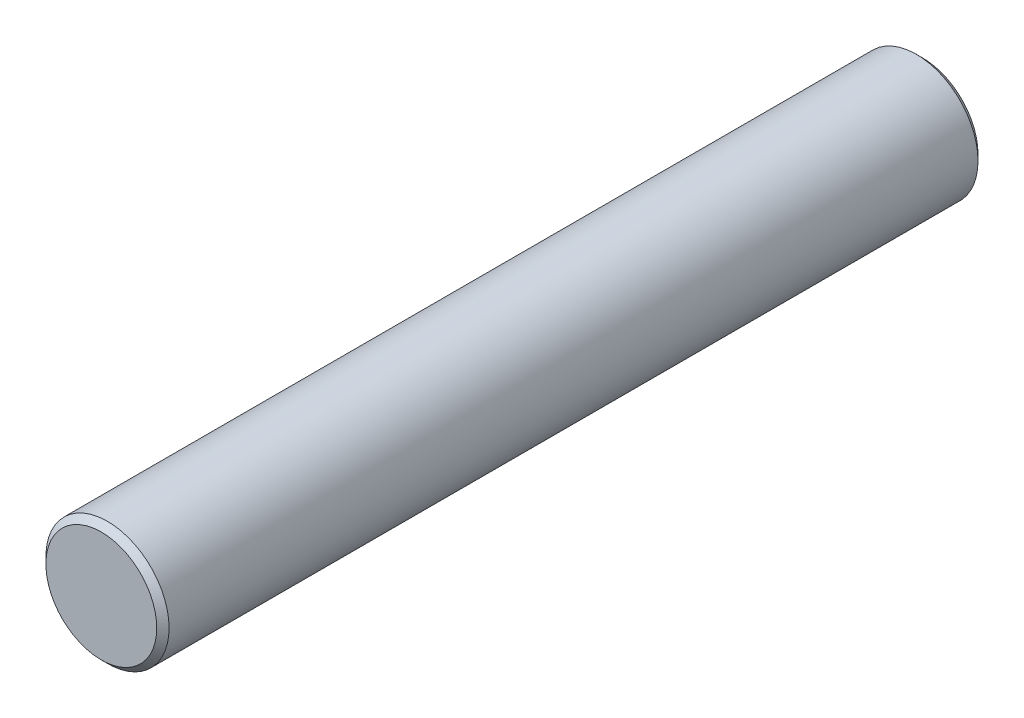
ISO-10303-21;
HEADER;
FILE_DESCRIPTION(('STEP AP214'),'2;1');
FILE_NAME('part.step','',(''),(''),'','','');
FILE_SCHEMA(('AUTOMOTIVE_DESIGN { 1 0 10303 214 1 1 1 1 }'));
ENDSEC;
DATA;
#1=APPLICATION_CONTEXT('core data for automotive mechanical design processes');
#2=APPLICATION_PROTOCOL_DEFINITION('international standard','automotive_design',2000,#1);
#3=PRODUCT_CONTEXT('',#1,'mechanical');
#4=PRODUCT('Part','Part','',(#3));
#5=PRODUCT_RELATED_PRODUCT_CATEGORY('part','',(#4));
#6=PRODUCT_DEFINITION_FORMATION('','',#4);
#7=PRODUCT_DEFINITION_CONTEXT('part definition',#1,'design');
#8=PRODUCT_DEFINITION('design','',#6,#7);
#9=PRODUCT_DEFINITION_SHAPE('','',#8);
#10=(LENGTH_UNIT() NAMED_UNIT(*) SI_UNIT(.MILLI.,.METRE.));
#11=(NAMED_UNIT(*) PLANE_ANGLE_UNIT() SI_UNIT($,.RADIAN.));
#12=(NAMED_UNIT(*) SI_UNIT($,.STERADIAN.) SOLID_ANGLE_UNIT());
#13=UNCERTAINTY_MEASURE_WITH_UNIT(LENGTH_MEASURE(1.E-05),#10,'distance_accuracy_value','');
#14=(GEOMETRIC_REPRESENTATION_CONTEXT(3) GLOBAL_UNCERTAINTY_ASSIGNED_CONTEXT((#13)) GLOBAL_UNIT_ASSIGNED_CONTEXT((#10,
#11,#12)) REPRESENTATION_CONTEXT('',''));
#15=CARTESIAN_POINT('',(0.,0.,0.));
#16=DIRECTION('',(0.,0.,1.));
#17=DIRECTION('',(1.,0.,0.));
#18=AXIS2_PLACEMENT_3D('',#15,#16,#17);
#19=CARTESIAN_POINT('',(0.,0.,10.));
#20=DIRECTION('',(0.,0.,-1.));
#21=DIRECTION('',(-1.,0.,0.));
#22=AXIS2_PLACEMENT_3D('',#19,#20,#21);
#23=CYLINDRICAL_SURFACE('',#22,1.5);
#24=CARTESIAN_POINT('',(0.,0.,-9.85));
#25=DIRECTION('',(0.,0.,1.));
#26=DIRECTION('',(1.,0.,0.));
#27=AXIS2_PLACEMENT_3D('',#24,#25,#26);
#28=CIRCLE('',#27,1.5);
#29=CARTESIAN_POINT('',(1.5,0.,-9.85));
#30=VERTEX_POINT('',#29);
#31=EDGE_CURVE('E27',#30,#30,#28,.T.);
#32=ORIENTED_EDGE('',*,*,#31,.T.);
#33=EDGE_LOOP('',(#32));
#34=FACE_BOUND('',#33,.T.);
#35=CARTESIAN_POINT('',(0.,0.,9.85));
#36=DIRECTION('',(0.,0.,1.));
#37=DIRECTION('',(1.,0.,0.));
#38=AXIS2_PLACEMENT_3D('',#35,#36,#37);
#39=CIRCLE('',#38,1.5);
#40=CARTESIAN_POINT('',(1.5,0.,9.85));
#41=VERTEX_POINT('',#40);
#42=EDGE_CURVE('E31',#41,#41,#39,.F.);
#43=ORIENTED_EDGE('',*,*,#42,.T.);
#44=EDGE_LOOP('',(#43));
#45=FACE_BOUND('',#44,.T.);
#46=ADVANCED_FACE('F15',(#34,#45),#23,.T.);
#47=CARTESIAN_POINT('',(0.,0.,10.));
#48=DIRECTION('',(0.,0.,1.));
#49=DIRECTION('',(1.,0.,0.));
#50=AXIS2_PLACEMENT_3D('',#47,#48,#49);
#51=PLANE('',#50);
#52=CARTESIAN_POINT('',(0.,0.,10.));
#53=DIRECTION('',(0.,0.,1.));
#54=DIRECTION('',(1.,0.,0.));
#55=AXIS2_PLACEMENT_3D('',#52,#53,#54);
#56=CIRCLE('',#55,1.35);
#57=CARTESIAN_POINT('',(1.35,0.,10.));
#58=VERTEX_POINT('',#57);
#59=EDGE_CURVE('E10',#58,#58,#56,.T.);
#60=ORIENTED_EDGE('',*,*,#59,.T.);
#61=EDGE_LOOP('',(#60));
#62=FACE_BOUND('',#61,.T.);
#63=ADVANCED_FACE('F49',(#62),#51,.T.);
#64=CARTESIAN_POINT('',(0.,0.,-10.));
#65=DIRECTION('',(0.,0.,1.));
#66=DIRECTION('',(1.,0.,0.));
#67=AXIS2_PLACEMENT_3D('',#64,#65,#66);
#68=PLANE('',#67);
#69=CARTESIAN_POINT('',(0.,0.,-10.));
#70=DIRECTION('',(0.,0.,1.));
#71=DIRECTION('',(1.,0.,0.));
#72=AXIS2_PLACEMENT_3D('',#69,#70,#71);
#73=CIRCLE('',#72,1.35);
#74=CARTESIAN_POINT('',(1.35,0.,-10.));
#75=VERTEX_POINT('',#74);
#76=EDGE_CURVE('E23',#75,#75,#73,.F.);
#77=ORIENTED_EDGE('',*,*,#76,.T.);
#78=EDGE_LOOP('',(#77));
#79=FACE_BOUND('',#78,.T.);
#80=ADVANCED_FACE('F46',(#79),#68,.F.);
#81=CARTESIAN_POINT('',(0.,0.,-9.85));
#82=DIRECTION('',(0.,0.,1.));
#83=DIRECTION('',(1.,0.,0.));
#84=AXIS2_PLACEMENT_3D('',#81,#82,#83);
#85=CONICAL_SURFACE('',#84,1.5,0.785398163397438);
#86=ORIENTED_EDGE('',*,*,#76,.F.);
#87=EDGE_LOOP('',(#86));
#88=FACE_BOUND('',#87,.T.);
#89=ORIENTED_EDGE('',*,*,#31,.F.);
#90=EDGE_LOOP('',(#89));
#91=FACE_BOUND('',#90,.T.);
#92=ADVANCED_FACE('F40',(#88,#91),#85,.T.);
#93=CARTESIAN_POINT('',(0.,0.,10.));
#94=DIRECTION('',(0.,0.,-1.));
#95=DIRECTION('',(-1.,0.,0.));
#96=AXIS2_PLACEMENT_3D('',#93,#94,#95);
#97=CONICAL_SURFACE('',#96,1.35,0.785398163397443);
#98=ORIENTED_EDGE('',*,*,#42,.F.);
#99=EDGE_LOOP('',(#98));
#100=FACE_BOUND('',#99,.T.);
#101=ORIENTED_EDGE('',*,*,#59,.F.);
#102=EDGE_LOOP('',(#101));
#103=FACE_BOUND('',#102,.T.);
#104=ADVANCED_FACE('F18',(#100,#103),#97,.T.);
#105=CLOSED_SHELL('',(#46,#63,#80,#92,#104));
#106=MANIFOLD_SOLID_BREP('B1',#105);
#107=ADVANCED_BREP_SHAPE_REPRESENTATION('',(#18,#106),#14);
#108=SHAPE_DEFINITION_REPRESENTATION(#9,#107);
ENDSEC;
END-ISO-10303-21;
